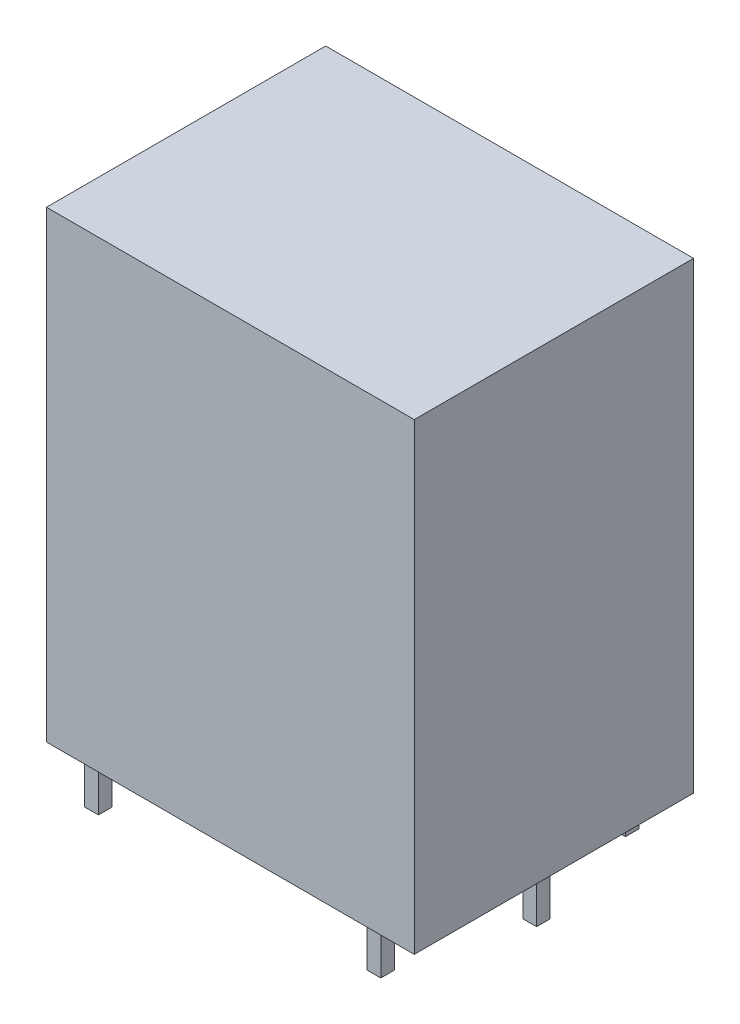
ISO-10303-21;
HEADER;
FILE_DESCRIPTION(('STEP AP214'),'2;1');
FILE_NAME('part.step','',(''),(''),'','','');
FILE_SCHEMA(('AUTOMOTIVE_DESIGN { 1 0 10303 214 1 1 1 1 }'));
ENDSEC;
DATA;
#1=APPLICATION_CONTEXT('core data for automotive mechanical design processes');
#2=APPLICATION_PROTOCOL_DEFINITION('international standard','automotive_design',2000,#1);
#3=PRODUCT_CONTEXT('',#1,'mechanical');
#4=PRODUCT('Part','Part','',(#3));
#5=PRODUCT_RELATED_PRODUCT_CATEGORY('part','',(#4));
#6=PRODUCT_DEFINITION_FORMATION('','',#4);
#7=PRODUCT_DEFINITION_CONTEXT('part definition',#1,'design');
#8=PRODUCT_DEFINITION('design','',#6,#7);
#9=PRODUCT_DEFINITION_SHAPE('','',#8);
#10=(LENGTH_UNIT() NAMED_UNIT(*) SI_UNIT(.MILLI.,.METRE.));
#11=(NAMED_UNIT(*) PLANE_ANGLE_UNIT() SI_UNIT($,.RADIAN.));
#12=(NAMED_UNIT(*) SI_UNIT($,.STERADIAN.) SOLID_ANGLE_UNIT());
#13=UNCERTAINTY_MEASURE_WITH_UNIT(LENGTH_MEASURE(1.E-05),#10,'distance_accuracy_value','');
#14=(GEOMETRIC_REPRESENTATION_CONTEXT(3) GLOBAL_UNCERTAINTY_ASSIGNED_CONTEXT((#13)) GLOBAL_UNIT_ASSIGNED_CONTEXT((#10,
#11,#12)) REPRESENTATION_CONTEXT('',''));
#15=CARTESIAN_POINT('',(0.,0.,0.));
#16=DIRECTION('',(0.,0.,1.));
#17=DIRECTION('',(1.,0.,0.));
#18=AXIS2_PLACEMENT_3D('',#15,#16,#17);
#19=CARTESIAN_POINT('',(-13.5,0.,10.25));
#20=DIRECTION('',(0.,1.,0.));
#21=DIRECTION('',(0.,0.,1.));
#22=AXIS2_PLACEMENT_3D('',#19,#20,#21);
#23=PLANE('',#22);
#24=DIRECTION('',(1.,0.,0.));
#25=VECTOR('',#24,1.);
#26=CARTESIAN_POINT('',(-10.46,0.,-9.48));
#27=LINE('',#26,#25);
#28=CARTESIAN_POINT('',(-11.46,0.,-9.48));
#29=VERTEX_POINT('',#28);
#30=CARTESIAN_POINT('',(-10.46,0.,-9.48));
#31=VERTEX_POINT('',#30);
#32=EDGE_CURVE('E214',#29,#31,#27,.T.);
#33=ORIENTED_EDGE('',*,*,#32,.F.);
#34=DIRECTION('',(0.,0.,-1.));
#35=VECTOR('',#34,1.);
#36=CARTESIAN_POINT('',(-11.46,0.,-9.48));
#37=LINE('',#36,#35);
#38=CARTESIAN_POINT('',(-11.46,0.,-8.48));
#39=VERTEX_POINT('',#38);
#40=EDGE_CURVE('E227',#39,#29,#37,.T.);
#41=ORIENTED_EDGE('',*,*,#40,.F.);
#42=DIRECTION('',(-1.,0.,0.));
#43=VECTOR('',#42,1.);
#44=CARTESIAN_POINT('',(-10.46,0.,-8.48));
#45=LINE('',#44,#43);
#46=CARTESIAN_POINT('',(-10.46,0.,-8.48));
#47=VERTEX_POINT('',#46);
#48=EDGE_CURVE('E236',#47,#39,#45,.T.);
#49=ORIENTED_EDGE('',*,*,#48,.F.);
#50=DIRECTION('',(0.,0.,1.));
#51=VECTOR('',#50,1.);
#52=CARTESIAN_POINT('',(-10.46,0.,-9.48));
#53=LINE('',#52,#51);
#54=EDGE_CURVE('E217',#31,#47,#53,.T.);
#55=ORIENTED_EDGE('',*,*,#54,.F.);
#56=EDGE_LOOP('',(#33,#41,#49,#55));
#57=FACE_BOUND('',#56,.T.);
#58=DIRECTION('',(0.,0.,1.));
#59=VECTOR('',#58,1.);
#60=CARTESIAN_POINT('',(10.27,0.,9.48));
#61=LINE('',#60,#59);
#62=CARTESIAN_POINT('',(10.27,0.,8.48));
#63=VERTEX_POINT('',#62);
#64=CARTESIAN_POINT('',(10.27,0.,9.48));
#65=VERTEX_POINT('',#64);
#66=EDGE_CURVE('E285',#63,#65,#61,.T.);
#67=ORIENTED_EDGE('',*,*,#66,.F.);
#68=DIRECTION('',(1.,0.,0.));
#69=VECTOR('',#68,1.);
#70=CARTESIAN_POINT('',(10.27,0.,8.48));
#71=LINE('',#70,#69);
#72=CARTESIAN_POINT('',(9.27000000000001,0.,8.48));
#73=VERTEX_POINT('',#72);
#74=EDGE_CURVE('E290',#73,#63,#71,.T.);
#75=ORIENTED_EDGE('',*,*,#74,.F.);
#76=DIRECTION('',(0.,0.,-1.));
#77=VECTOR('',#76,1.);
#78=CARTESIAN_POINT('',(9.27000000000001,0.,9.48));
#79=LINE('',#78,#77);
#80=CARTESIAN_POINT('',(9.27000000000001,0.,9.48));
#81=VERTEX_POINT('',#80);
#82=EDGE_CURVE('E302',#81,#73,#79,.T.);
#83=ORIENTED_EDGE('',*,*,#82,.F.);
#84=DIRECTION('',(-1.,0.,0.));
#85=VECTOR('',#84,1.);
#86=CARTESIAN_POINT('',(10.27,0.,9.48));
#87=LINE('',#86,#85);
#88=EDGE_CURVE('E299',#65,#81,#87,.T.);
#89=ORIENTED_EDGE('',*,*,#88,.F.);
#90=EDGE_LOOP('',(#67,#75,#83,#89));
#91=FACE_BOUND('',#90,.T.);
#92=DIRECTION('',(0.,0.,1.));
#93=VECTOR('',#92,1.);
#94=CARTESIAN_POINT('',(-13.5,0.,-10.25));
#95=LINE('',#94,#93);
#96=CARTESIAN_POINT('',(-13.5,0.,-10.25));
#97=VERTEX_POINT('',#96);
#98=CARTESIAN_POINT('',(-13.5,0.,10.25));
#99=VERTEX_POINT('',#98);
#100=EDGE_CURVE('E351',#97,#99,#95,.T.);
#101=ORIENTED_EDGE('',*,*,#100,.F.);
#102=DIRECTION('',(-1.,0.,0.));
#103=VECTOR('',#102,1.);
#104=CARTESIAN_POINT('',(-13.5,0.,-10.25));
#105=LINE('',#104,#103);
#106=CARTESIAN_POINT('',(13.5,0.,-10.25));
#107=VERTEX_POINT('',#106);
#108=EDGE_CURVE('E356',#107,#97,#105,.T.);
#109=ORIENTED_EDGE('',*,*,#108,.F.);
#110=DIRECTION('',(0.,0.,-1.));
#111=VECTOR('',#110,1.);
#112=CARTESIAN_POINT('',(13.5,0.,-10.25));
#113=LINE('',#112,#111);
#114=CARTESIAN_POINT('',(13.5,0.,10.25));
#115=VERTEX_POINT('',#114);
#116=EDGE_CURVE('E367',#115,#107,#113,.T.);
#117=ORIENTED_EDGE('',*,*,#116,.F.);
#118=DIRECTION('',(1.,0.,0.));
#119=VECTOR('',#118,1.);
#120=CARTESIAN_POINT('',(-13.5,0.,10.25));
#121=LINE('',#120,#119);
#122=EDGE_CURVE('E365',#99,#115,#121,.T.);
#123=ORIENTED_EDGE('',*,*,#122,.F.);
#124=EDGE_LOOP('',(#101,#109,#117,#123));
#125=FACE_BOUND('',#124,.T.);
#126=DIRECTION('',(0.,0.,1.));
#127=VECTOR('',#126,1.);
#128=CARTESIAN_POINT('',(12.73,0.,-0.499999999999999));
#129=LINE('',#128,#127);
#130=CARTESIAN_POINT('',(12.73,0.,-0.499999999999999));
#131=VERTEX_POINT('',#130);
#132=CARTESIAN_POINT('',(12.73,0.,0.500000000000007));
#133=VERTEX_POINT('',#132);
#134=EDGE_CURVE('E318',#131,#133,#129,.T.);
#135=ORIENTED_EDGE('',*,*,#134,.F.);
#136=DIRECTION('',(1.,0.,0.));
#137=VECTOR('',#136,1.);
#138=CARTESIAN_POINT('',(12.73,0.,-0.499999999999999));
#139=LINE('',#138,#137);
#140=CARTESIAN_POINT('',(11.73,0.,-0.499999999999999));
#141=VERTEX_POINT('',#140);
#142=EDGE_CURVE('E323',#141,#131,#139,.T.);
#143=ORIENTED_EDGE('',*,*,#142,.F.);
#144=DIRECTION('',(0.,0.,-1.));
#145=VECTOR('',#144,1.);
#146=CARTESIAN_POINT('',(11.73,0.,-0.499999999999999));
#147=LINE('',#146,#145);
#148=CARTESIAN_POINT('',(11.73,0.,0.500000000000009));
#149=VERTEX_POINT('',#148);
#150=EDGE_CURVE('E335',#149,#141,#147,.T.);
#151=ORIENTED_EDGE('',*,*,#150,.F.);
#152=DIRECTION('',(-1.,0.,0.));
#153=VECTOR('',#152,1.);
#154=CARTESIAN_POINT('',(12.73,0.,0.500000000000008));
#155=LINE('',#154,#153);
#156=EDGE_CURVE('E332',#133,#149,#155,.T.);
#157=ORIENTED_EDGE('',*,*,#156,.F.);
#158=EDGE_LOOP('',(#135,#143,#151,#157));
#159=FACE_BOUND('',#158,.T.);
#160=DIRECTION('',(0.,0.,1.));
#161=VECTOR('',#160,1.);
#162=CARTESIAN_POINT('',(-10.46,0.,9.48));
#163=LINE('',#162,#161);
#164=CARTESIAN_POINT('',(-10.46,0.,8.48));
#165=VERTEX_POINT('',#164);
#166=CARTESIAN_POINT('',(-10.46,0.,9.48));
#167=VERTEX_POINT('',#166);
#168=EDGE_CURVE('E252',#165,#167,#163,.T.);
#169=ORIENTED_EDGE('',*,*,#168,.F.);
#170=DIRECTION('',(1.,0.,0.));
#171=VECTOR('',#170,1.);
#172=CARTESIAN_POINT('',(-10.46,0.,8.48));
#173=LINE('',#172,#171);
#174=CARTESIAN_POINT('',(-11.46,0.,8.48));
#175=VERTEX_POINT('',#174);
#176=EDGE_CURVE('E257',#175,#165,#173,.T.);
#177=ORIENTED_EDGE('',*,*,#176,.F.);
#178=DIRECTION('',(0.,0.,-1.));
#179=VECTOR('',#178,1.);
#180=CARTESIAN_POINT('',(-11.46,0.,9.48));
#181=LINE('',#180,#179);
#182=CARTESIAN_POINT('',(-11.46,0.,9.48));
#183=VERTEX_POINT('',#182);
#184=EDGE_CURVE('E269',#183,#175,#181,.T.);
#185=ORIENTED_EDGE('',*,*,#184,.F.);
#186=DIRECTION('',(-1.,0.,0.));
#187=VECTOR('',#186,1.);
#188=CARTESIAN_POINT('',(-10.46,0.,9.48));
#189=LINE('',#188,#187);
#190=EDGE_CURVE('E266',#167,#183,#189,.T.);
#191=ORIENTED_EDGE('',*,*,#190,.F.);
#192=EDGE_LOOP('',(#169,#177,#185,#191));
#193=FACE_BOUND('',#192,.T.);
#194=DIRECTION('',(1.,0.,0.));
#195=VECTOR('',#194,1.);
#196=CARTESIAN_POINT('',(10.27,0.,-9.48));
#197=LINE('',#196,#195);
#198=CARTESIAN_POINT('',(9.27000000000001,0.,-9.48));
#199=VERTEX_POINT('',#198);
#200=CARTESIAN_POINT('',(10.27,0.,-9.48));
#201=VERTEX_POINT('',#200);
#202=EDGE_CURVE('E213',#199,#201,#197,.T.);
#203=ORIENTED_EDGE('',*,*,#202,.F.);
#204=DIRECTION('',(0.,0.,-1.));
#205=VECTOR('',#204,1.);
#206=CARTESIAN_POINT('',(9.27000000000001,0.,-9.48));
#207=LINE('',#206,#205);
#208=CARTESIAN_POINT('',(9.27000000000001,0.,-8.48));
#209=VERTEX_POINT('',#208);
#210=EDGE_CURVE('E210',#209,#199,#207,.T.);
#211=ORIENTED_EDGE('',*,*,#210,.F.);
#212=DIRECTION('',(-1.,0.,0.));
#213=VECTOR('',#212,1.);
#214=CARTESIAN_POINT('',(10.27,0.,-8.48));
#215=LINE('',#214,#213);
#216=CARTESIAN_POINT('',(10.27,0.,-8.48));
#217=VERTEX_POINT('',#216);
#218=EDGE_CURVE('E52',#217,#209,#215,.T.);
#219=ORIENTED_EDGE('',*,*,#218,.F.);
#220=DIRECTION('',(0.,0.,1.));
#221=VECTOR('',#220,1.);
#222=CARTESIAN_POINT('',(10.27,0.,-9.48));
#223=LINE('',#222,#221);
#224=EDGE_CURVE('E47',#201,#217,#223,.T.);
#225=ORIENTED_EDGE('',*,*,#224,.F.);
#226=EDGE_LOOP('',(#203,#211,#219,#225));
#227=FACE_BOUND('',#226,.T.);
#228=ADVANCED_FACE('F32',(#57,#91,#125,#159,#193,#227),#23,.F.);
#229=CARTESIAN_POINT('',(-13.5,34.,-10.25));
#230=DIRECTION('',(1.,0.,0.));
#231=DIRECTION('',(0.,0.,-1.));
#232=AXIS2_PLACEMENT_3D('',#229,#230,#231);
#233=PLANE('',#232);
#234=ORIENTED_EDGE('',*,*,#100,.T.);
#235=DIRECTION('',(0.,-1.,0.));
#236=VECTOR('',#235,1.);
#237=CARTESIAN_POINT('',(-13.5,34.,10.25));
#238=LINE('',#237,#236);
#239=CARTESIAN_POINT('',(-13.5,34.,10.25));
#240=VERTEX_POINT('',#239);
#241=EDGE_CURVE('E11',#240,#99,#238,.T.);
#242=ORIENTED_EDGE('',*,*,#241,.F.);
#243=DIRECTION('',(0.,0.,1.));
#244=VECTOR('',#243,1.);
#245=CARTESIAN_POINT('',(-13.5,34.,-10.25));
#246=LINE('',#245,#244);
#247=CARTESIAN_POINT('',(-13.5,34.,-10.25));
#248=VERTEX_POINT('',#247);
#249=EDGE_CURVE('E352',#248,#240,#246,.T.);
#250=ORIENTED_EDGE('',*,*,#249,.F.);
#251=DIRECTION('',(0.,-1.,0.));
#252=VECTOR('',#251,1.);
#253=CARTESIAN_POINT('',(-13.5,34.,-10.25));
#254=LINE('',#253,#252);
#255=EDGE_CURVE('E362',#248,#97,#254,.T.);
#256=ORIENTED_EDGE('',*,*,#255,.T.);
#257=EDGE_LOOP('',(#234,#242,#250,#256));
#258=FACE_BOUND('',#257,.T.);
#259=ADVANCED_FACE('F34',(#258),#233,.F.);
#260=CARTESIAN_POINT('',(-13.5,34.,10.25));
#261=DIRECTION('',(0.,0.,-1.));
#262=DIRECTION('',(-1.,0.,0.));
#263=AXIS2_PLACEMENT_3D('',#260,#261,#262);
#264=PLANE('',#263);
#265=ORIENTED_EDGE('',*,*,#122,.T.);
#266=DIRECTION('',(0.,-1.,0.));
#267=VECTOR('',#266,1.);
#268=CARTESIAN_POINT('',(13.5,34.,10.25));
#269=LINE('',#268,#267);
#270=CARTESIAN_POINT('',(13.5,34.,10.25));
#271=VERTEX_POINT('',#270);
#272=EDGE_CURVE('E40',#271,#115,#269,.T.);
#273=ORIENTED_EDGE('',*,*,#272,.F.);
#274=DIRECTION('',(1.,0.,0.));
#275=VECTOR('',#274,1.);
#276=CARTESIAN_POINT('',(-13.5,34.,10.25));
#277=LINE('',#276,#275);
#278=EDGE_CURVE('E355',#240,#271,#277,.T.);
#279=ORIENTED_EDGE('',*,*,#278,.F.);
#280=ORIENTED_EDGE('',*,*,#241,.T.);
#281=EDGE_LOOP('',(#265,#273,#279,#280));
#282=FACE_BOUND('',#281,.T.);
#283=ADVANCED_FACE('F395',(#282),#264,.F.);
#284=CARTESIAN_POINT('',(13.5,34.,-10.25));
#285=DIRECTION('',(-1.,0.,0.));
#286=DIRECTION('',(0.,0.,1.));
#287=AXIS2_PLACEMENT_3D('',#284,#285,#286);
#288=PLANE('',#287);
#289=ORIENTED_EDGE('',*,*,#116,.T.);
#290=DIRECTION('',(0.,-1.,0.));
#291=VECTOR('',#290,1.);
#292=CARTESIAN_POINT('',(13.5,34.,-10.25));
#293=LINE('',#292,#291);
#294=CARTESIAN_POINT('',(13.5,34.,-10.25));
#295=VERTEX_POINT('',#294);
#296=EDGE_CURVE('E372',#295,#107,#293,.T.);
#297=ORIENTED_EDGE('',*,*,#296,.F.);
#298=DIRECTION('',(0.,0.,-1.));
#299=VECTOR('',#298,1.);
#300=CARTESIAN_POINT('',(13.5,34.,-10.25));
#301=LINE('',#300,#299);
#302=EDGE_CURVE('E358',#271,#295,#301,.T.);
#303=ORIENTED_EDGE('',*,*,#302,.F.);
#304=ORIENTED_EDGE('',*,*,#272,.T.);
#305=EDGE_LOOP('',(#289,#297,#303,#304));
#306=FACE_BOUND('',#305,.T.);
#307=ADVANCED_FACE('F379',(#306),#288,.F.);
#308=CARTESIAN_POINT('',(-13.5,34.,-10.25));
#309=DIRECTION('',(0.,0.,1.));
#310=DIRECTION('',(1.,0.,0.));
#311=AXIS2_PLACEMENT_3D('',#308,#309,#310);
#312=PLANE('',#311);
#313=ORIENTED_EDGE('',*,*,#108,.T.);
#314=ORIENTED_EDGE('',*,*,#255,.F.);
#315=DIRECTION('',(-1.,0.,0.));
#316=VECTOR('',#315,1.);
#317=CARTESIAN_POINT('',(-13.5,34.,-10.25));
#318=LINE('',#317,#316);
#319=EDGE_CURVE('E360',#295,#248,#318,.T.);
#320=ORIENTED_EDGE('',*,*,#319,.F.);
#321=ORIENTED_EDGE('',*,*,#296,.T.);
#322=EDGE_LOOP('',(#313,#314,#320,#321));
#323=FACE_BOUND('',#322,.T.);
#324=ADVANCED_FACE('F388',(#323),#312,.F.);
#325=CARTESIAN_POINT('',(-13.5,34.,10.25));
#326=DIRECTION('',(0.,1.,0.));
#327=DIRECTION('',(0.,0.,1.));
#328=AXIS2_PLACEMENT_3D('',#325,#326,#327);
#329=PLANE('',#328);
#330=ORIENTED_EDGE('',*,*,#249,.T.);
#331=ORIENTED_EDGE('',*,*,#278,.T.);
#332=ORIENTED_EDGE('',*,*,#302,.T.);
#333=ORIENTED_EDGE('',*,*,#319,.T.);
#334=EDGE_LOOP('',(#330,#331,#332,#333));
#335=FACE_BOUND('',#334,.T.);
#336=ADVANCED_FACE('F394',(#335),#329,.T.);
#337=CARTESIAN_POINT('',(12.73,-3.5,-0.499999999999999));
#338=DIRECTION('',(-1.,0.,0.));
#339=DIRECTION('',(0.,0.,1.));
#340=AXIS2_PLACEMENT_3D('',#337,#338,#339);
#341=PLANE('',#340);
#342=ORIENTED_EDGE('',*,*,#134,.T.);
#343=DIRECTION('',(0.,1.,0.));
#344=VECTOR('',#343,1.);
#345=CARTESIAN_POINT('',(12.73,-3.5,0.500000000000008));
#346=LINE('',#345,#344);
#347=CARTESIAN_POINT('',(12.73,-3.5,0.500000000000008));
#348=VERTEX_POINT('',#347);
#349=EDGE_CURVE('E348',#348,#133,#346,.T.);
#350=ORIENTED_EDGE('',*,*,#349,.F.);
#351=DIRECTION('',(0.,0.,1.));
#352=VECTOR('',#351,1.);
#353=CARTESIAN_POINT('',(12.73,-3.5,-0.499999999999999));
#354=LINE('',#353,#352);
#355=CARTESIAN_POINT('',(12.73,-3.5,-0.499999999999999));
#356=VERTEX_POINT('',#355);
#357=EDGE_CURVE('E319',#356,#348,#354,.T.);
#358=ORIENTED_EDGE('',*,*,#357,.F.);
#359=DIRECTION('',(0.,1.,0.));
#360=VECTOR('',#359,1.);
#361=CARTESIAN_POINT('',(12.73,-3.5,-0.499999999999999));
#362=LINE('',#361,#360);
#363=EDGE_CURVE('E329',#356,#131,#362,.T.);
#364=ORIENTED_EDGE('',*,*,#363,.T.);
#365=EDGE_LOOP('',(#342,#350,#358,#364));
#366=FACE_BOUND('',#365,.T.);
#367=ADVANCED_FACE('F415',(#366),#341,.F.);
#368=CARTESIAN_POINT('',(12.73,-3.5,0.500000000000008));
#369=DIRECTION('',(0.,0.,-1.));
#370=DIRECTION('',(-1.,0.,0.));
#371=AXIS2_PLACEMENT_3D('',#368,#369,#370);
#372=PLANE('',#371);
#373=ORIENTED_EDGE('',*,*,#156,.T.);
#374=DIRECTION('',(0.,1.,0.));
#375=VECTOR('',#374,1.);
#376=CARTESIAN_POINT('',(11.73,-3.5,0.500000000000008));
#377=LINE('',#376,#375);
#378=CARTESIAN_POINT('',(11.73,-3.5,0.500000000000008));
#379=VERTEX_POINT('',#378);
#380=EDGE_CURVE('E345',#379,#149,#377,.T.);
#381=ORIENTED_EDGE('',*,*,#380,.F.);
#382=DIRECTION('',(-1.,0.,0.));
#383=VECTOR('',#382,1.);
#384=CARTESIAN_POINT('',(12.73,-3.5,0.500000000000008));
#385=LINE('',#384,#383);
#386=EDGE_CURVE('E322',#348,#379,#385,.T.);
#387=ORIENTED_EDGE('',*,*,#386,.F.);
#388=ORIENTED_EDGE('',*,*,#349,.T.);
#389=EDGE_LOOP('',(#373,#381,#387,#388));
#390=FACE_BOUND('',#389,.T.);
#391=ADVANCED_FACE('F419',(#390),#372,.F.);
#392=CARTESIAN_POINT('',(11.73,-3.5,-0.499999999999999));
#393=DIRECTION('',(1.,0.,0.));
#394=DIRECTION('',(0.,0.,-1.));
#395=AXIS2_PLACEMENT_3D('',#392,#393,#394);
#396=PLANE('',#395);
#397=ORIENTED_EDGE('',*,*,#150,.T.);
#398=DIRECTION('',(0.,1.,0.));
#399=VECTOR('',#398,1.);
#400=CARTESIAN_POINT('',(11.73,-3.5,-0.499999999999999));
#401=LINE('',#400,#399);
#402=CARTESIAN_POINT('',(11.73,-3.5,-0.499999999999999));
#403=VERTEX_POINT('',#402);
#404=EDGE_CURVE('E342',#403,#141,#401,.T.);
#405=ORIENTED_EDGE('',*,*,#404,.F.);
#406=DIRECTION('',(0.,0.,-1.));
#407=VECTOR('',#406,1.);
#408=CARTESIAN_POINT('',(11.73,-3.5,-0.499999999999999));
#409=LINE('',#408,#407);
#410=EDGE_CURVE('E325',#379,#403,#409,.T.);
#411=ORIENTED_EDGE('',*,*,#410,.F.);
#412=ORIENTED_EDGE('',*,*,#380,.T.);
#413=EDGE_LOOP('',(#397,#405,#411,#412));
#414=FACE_BOUND('',#413,.T.);
#415=ADVANCED_FACE('F424',(#414),#396,.F.);
#416=CARTESIAN_POINT('',(12.73,-3.5,-0.499999999999999));
#417=DIRECTION('',(0.,0.,1.));
#418=DIRECTION('',(1.,0.,0.));
#419=AXIS2_PLACEMENT_3D('',#416,#417,#418);
#420=PLANE('',#419);
#421=ORIENTED_EDGE('',*,*,#142,.T.);
#422=ORIENTED_EDGE('',*,*,#363,.F.);
#423=DIRECTION('',(1.,0.,0.));
#424=VECTOR('',#423,1.);
#425=CARTESIAN_POINT('',(12.73,-3.5,-0.499999999999999));
#426=LINE('',#425,#424);
#427=EDGE_CURVE('E327',#403,#356,#426,.T.);
#428=ORIENTED_EDGE('',*,*,#427,.F.);
#429=ORIENTED_EDGE('',*,*,#404,.T.);
#430=EDGE_LOOP('',(#421,#422,#428,#429));
#431=FACE_BOUND('',#430,.T.);
#432=ADVANCED_FACE('F430',(#431),#420,.F.);
#433=CARTESIAN_POINT('',(12.73,-3.5,0.500000000000008));
#434=DIRECTION('',(0.,-1.,0.));
#435=DIRECTION('',(0.,0.,-1.));
#436=AXIS2_PLACEMENT_3D('',#433,#434,#435);
#437=PLANE('',#436);
#438=ORIENTED_EDGE('',*,*,#357,.T.);
#439=ORIENTED_EDGE('',*,*,#386,.T.);
#440=ORIENTED_EDGE('',*,*,#410,.T.);
#441=ORIENTED_EDGE('',*,*,#427,.T.);
#442=EDGE_LOOP('',(#438,#439,#440,#441));
#443=FACE_BOUND('',#442,.T.);
#444=ADVANCED_FACE('F434',(#443),#437,.T.);
#445=CARTESIAN_POINT('',(10.27,-3.5,9.48));
#446=DIRECTION('',(-1.,0.,0.));
#447=DIRECTION('',(0.,0.,1.));
#448=AXIS2_PLACEMENT_3D('',#445,#446,#447);
#449=PLANE('',#448);
#450=ORIENTED_EDGE('',*,*,#66,.T.);
#451=DIRECTION('',(0.,1.,0.));
#452=VECTOR('',#451,1.);
#453=CARTESIAN_POINT('',(10.27,-3.5,9.48));
#454=LINE('',#453,#452);
#455=CARTESIAN_POINT('',(10.27,-3.5,9.48));
#456=VERTEX_POINT('',#455);
#457=EDGE_CURVE('E315',#456,#65,#454,.T.);
#458=ORIENTED_EDGE('',*,*,#457,.F.);
#459=DIRECTION('',(0.,0.,1.));
#460=VECTOR('',#459,1.);
#461=CARTESIAN_POINT('',(10.27,-3.5,9.48));
#462=LINE('',#461,#460);
#463=CARTESIAN_POINT('',(10.27,-3.5,8.48));
#464=VERTEX_POINT('',#463);
#465=EDGE_CURVE('E286',#464,#456,#462,.T.);
#466=ORIENTED_EDGE('',*,*,#465,.F.);
#467=DIRECTION('',(0.,1.,0.));
#468=VECTOR('',#467,1.);
#469=CARTESIAN_POINT('',(10.27,-3.5,8.48));
#470=LINE('',#469,#468);
#471=EDGE_CURVE('E296',#464,#63,#470,.T.);
#472=ORIENTED_EDGE('',*,*,#471,.T.);
#473=EDGE_LOOP('',(#450,#458,#466,#472));
#474=FACE_BOUND('',#473,.T.);
#475=ADVANCED_FACE('F438',(#474),#449,.F.);
#476=CARTESIAN_POINT('',(10.27,-3.5,9.48));
#477=DIRECTION('',(0.,0.,-1.));
#478=DIRECTION('',(-1.,0.,0.));
#479=AXIS2_PLACEMENT_3D('',#476,#477,#478);
#480=PLANE('',#479);
#481=ORIENTED_EDGE('',*,*,#88,.T.);
#482=DIRECTION('',(0.,1.,0.));
#483=VECTOR('',#482,1.);
#484=CARTESIAN_POINT('',(9.27000000000001,-3.5,9.48));
#485=LINE('',#484,#483);
#486=CARTESIAN_POINT('',(9.27000000000001,-3.5,9.48));
#487=VERTEX_POINT('',#486);
#488=EDGE_CURVE('E312',#487,#81,#485,.T.);
#489=ORIENTED_EDGE('',*,*,#488,.F.);
#490=DIRECTION('',(-1.,0.,0.));
#491=VECTOR('',#490,1.);
#492=CARTESIAN_POINT('',(10.27,-3.5,9.48));
#493=LINE('',#492,#491);
#494=EDGE_CURVE('E289',#456,#487,#493,.T.);
#495=ORIENTED_EDGE('',*,*,#494,.F.);
#496=ORIENTED_EDGE('',*,*,#457,.T.);
#497=EDGE_LOOP('',(#481,#489,#495,#496));
#498=FACE_BOUND('',#497,.T.);
#499=ADVANCED_FACE('F442',(#498),#480,.F.);
#500=CARTESIAN_POINT('',(9.27000000000001,-3.5,9.48));
#501=DIRECTION('',(1.,0.,0.));
#502=DIRECTION('',(0.,0.,-1.));
#503=AXIS2_PLACEMENT_3D('',#500,#501,#502);
#504=PLANE('',#503);
#505=ORIENTED_EDGE('',*,*,#82,.T.);
#506=DIRECTION('',(0.,1.,0.));
#507=VECTOR('',#506,1.);
#508=CARTESIAN_POINT('',(9.27000000000001,-3.5,8.48));
#509=LINE('',#508,#507);
#510=CARTESIAN_POINT('',(9.27000000000001,-3.5,8.48));
#511=VERTEX_POINT('',#510);
#512=EDGE_CURVE('E309',#511,#73,#509,.T.);
#513=ORIENTED_EDGE('',*,*,#512,.F.);
#514=DIRECTION('',(0.,0.,-1.));
#515=VECTOR('',#514,1.);
#516=CARTESIAN_POINT('',(9.27000000000001,-3.5,9.48));
#517=LINE('',#516,#515);
#518=EDGE_CURVE('E292',#487,#511,#517,.T.);
#519=ORIENTED_EDGE('',*,*,#518,.F.);
#520=ORIENTED_EDGE('',*,*,#488,.T.);
#521=EDGE_LOOP('',(#505,#513,#519,#520));
#522=FACE_BOUND('',#521,.T.);
#523=ADVANCED_FACE('F446',(#522),#504,.F.);
#524=CARTESIAN_POINT('',(10.27,-3.5,8.48));
#525=DIRECTION('',(0.,0.,1.));
#526=DIRECTION('',(1.,0.,0.));
#527=AXIS2_PLACEMENT_3D('',#524,#525,#526);
#528=PLANE('',#527);
#529=ORIENTED_EDGE('',*,*,#74,.T.);
#530=ORIENTED_EDGE('',*,*,#471,.F.);
#531=DIRECTION('',(1.,0.,0.));
#532=VECTOR('',#531,1.);
#533=CARTESIAN_POINT('',(10.27,-3.5,8.48));
#534=LINE('',#533,#532);
#535=EDGE_CURVE('E294',#511,#464,#534,.T.);
#536=ORIENTED_EDGE('',*,*,#535,.F.);
#537=ORIENTED_EDGE('',*,*,#512,.T.);
#538=EDGE_LOOP('',(#529,#530,#536,#537));
#539=FACE_BOUND('',#538,.T.);
#540=ADVANCED_FACE('F450',(#539),#528,.F.);
#541=CARTESIAN_POINT('',(10.27,-3.5,9.48));
#542=DIRECTION('',(0.,1.,0.));
#543=DIRECTION('',(0.,0.,1.));
#544=AXIS2_PLACEMENT_3D('',#541,#542,#543);
#545=PLANE('',#544);
#546=ORIENTED_EDGE('',*,*,#465,.T.);
#547=ORIENTED_EDGE('',*,*,#494,.T.);
#548=ORIENTED_EDGE('',*,*,#518,.T.);
#549=ORIENTED_EDGE('',*,*,#535,.T.);
#550=EDGE_LOOP('',(#546,#547,#548,#549));
#551=FACE_BOUND('',#550,.T.);
#552=ADVANCED_FACE('F454',(#551),#545,.F.);
#553=CARTESIAN_POINT('',(-10.46,-3.5,9.48));
#554=DIRECTION('',(-1.,0.,0.));
#555=DIRECTION('',(0.,0.,1.));
#556=AXIS2_PLACEMENT_3D('',#553,#554,#555);
#557=PLANE('',#556);
#558=ORIENTED_EDGE('',*,*,#168,.T.);
#559=DIRECTION('',(0.,1.,0.));
#560=VECTOR('',#559,1.);
#561=CARTESIAN_POINT('',(-10.46,-3.5,9.48));
#562=LINE('',#561,#560);
#563=CARTESIAN_POINT('',(-10.46,-3.5,9.48));
#564=VERTEX_POINT('',#563);
#565=EDGE_CURVE('E282',#564,#167,#562,.T.);
#566=ORIENTED_EDGE('',*,*,#565,.F.);
#567=DIRECTION('',(0.,0.,1.));
#568=VECTOR('',#567,1.);
#569=CARTESIAN_POINT('',(-10.46,-3.5,9.48));
#570=LINE('',#569,#568);
#571=CARTESIAN_POINT('',(-10.46,-3.5,8.48));
#572=VERTEX_POINT('',#571);
#573=EDGE_CURVE('E253',#572,#564,#570,.T.);
#574=ORIENTED_EDGE('',*,*,#573,.F.);
#575=DIRECTION('',(0.,1.,0.));
#576=VECTOR('',#575,1.);
#577=CARTESIAN_POINT('',(-10.46,-3.5,8.48));
#578=LINE('',#577,#576);
#579=EDGE_CURVE('E263',#572,#165,#578,.T.);
#580=ORIENTED_EDGE('',*,*,#579,.T.);
#581=EDGE_LOOP('',(#558,#566,#574,#580));
#582=FACE_BOUND('',#581,.T.);
#583=ADVANCED_FACE('F458',(#582),#557,.F.);
#584=CARTESIAN_POINT('',(-10.46,-3.5,9.48));
#585=DIRECTION('',(0.,0.,-1.));
#586=DIRECTION('',(-1.,0.,0.));
#587=AXIS2_PLACEMENT_3D('',#584,#585,#586);
#588=PLANE('',#587);
#589=ORIENTED_EDGE('',*,*,#190,.T.);
#590=DIRECTION('',(0.,1.,0.));
#591=VECTOR('',#590,1.);
#592=CARTESIAN_POINT('',(-11.46,-3.5,9.48));
#593=LINE('',#592,#591);
#594=CARTESIAN_POINT('',(-11.46,-3.5,9.48));
#595=VERTEX_POINT('',#594);
#596=EDGE_CURVE('E279',#595,#183,#593,.T.);
#597=ORIENTED_EDGE('',*,*,#596,.F.);
#598=DIRECTION('',(-1.,0.,0.));
#599=VECTOR('',#598,1.);
#600=CARTESIAN_POINT('',(-10.46,-3.5,9.48));
#601=LINE('',#600,#599);
#602=EDGE_CURVE('E256',#564,#595,#601,.T.);
#603=ORIENTED_EDGE('',*,*,#602,.F.);
#604=ORIENTED_EDGE('',*,*,#565,.T.);
#605=EDGE_LOOP('',(#589,#597,#603,#604));
#606=FACE_BOUND('',#605,.T.);
#607=ADVANCED_FACE('F462',(#606),#588,.F.);
#608=CARTESIAN_POINT('',(-11.46,-3.5,9.48));
#609=DIRECTION('',(1.,0.,0.));
#610=DIRECTION('',(0.,0.,-1.));
#611=AXIS2_PLACEMENT_3D('',#608,#609,#610);
#612=PLANE('',#611);
#613=ORIENTED_EDGE('',*,*,#184,.T.);
#614=DIRECTION('',(0.,1.,0.));
#615=VECTOR('',#614,1.);
#616=CARTESIAN_POINT('',(-11.46,-3.5,8.48));
#617=LINE('',#616,#615);
#618=CARTESIAN_POINT('',(-11.46,-3.5,8.48));
#619=VERTEX_POINT('',#618);
#620=EDGE_CURVE('E276',#619,#175,#617,.T.);
#621=ORIENTED_EDGE('',*,*,#620,.F.);
#622=DIRECTION('',(0.,0.,-1.));
#623=VECTOR('',#622,1.);
#624=CARTESIAN_POINT('',(-11.46,-3.5,9.48));
#625=LINE('',#624,#623);
#626=EDGE_CURVE('E259',#595,#619,#625,.T.);
#627=ORIENTED_EDGE('',*,*,#626,.F.);
#628=ORIENTED_EDGE('',*,*,#596,.T.);
#629=EDGE_LOOP('',(#613,#621,#627,#628));
#630=FACE_BOUND('',#629,.T.);
#631=ADVANCED_FACE('F466',(#630),#612,.F.);
#632=CARTESIAN_POINT('',(-10.46,-3.5,8.48));
#633=DIRECTION('',(0.,0.,1.));
#634=DIRECTION('',(1.,0.,0.));
#635=AXIS2_PLACEMENT_3D('',#632,#633,#634);
#636=PLANE('',#635);
#637=ORIENTED_EDGE('',*,*,#176,.T.);
#638=ORIENTED_EDGE('',*,*,#579,.F.);
#639=DIRECTION('',(1.,0.,0.));
#640=VECTOR('',#639,1.);
#641=CARTESIAN_POINT('',(-10.46,-3.5,8.48));
#642=LINE('',#641,#640);
#643=EDGE_CURVE('E261',#619,#572,#642,.T.);
#644=ORIENTED_EDGE('',*,*,#643,.F.);
#645=ORIENTED_EDGE('',*,*,#620,.T.);
#646=EDGE_LOOP('',(#637,#638,#644,#645));
#647=FACE_BOUND('',#646,.T.);
#648=ADVANCED_FACE('F470',(#647),#636,.F.);
#649=CARTESIAN_POINT('',(-10.46,-3.5,8.48));
#650=DIRECTION('',(0.,1.,0.));
#651=DIRECTION('',(0.,0.,1.));
#652=AXIS2_PLACEMENT_3D('',#649,#650,#651);
#653=PLANE('',#652);
#654=ORIENTED_EDGE('',*,*,#573,.T.);
#655=ORIENTED_EDGE('',*,*,#602,.T.);
#656=ORIENTED_EDGE('',*,*,#626,.T.);
#657=ORIENTED_EDGE('',*,*,#643,.T.);
#658=EDGE_LOOP('',(#654,#655,#656,#657));
#659=FACE_BOUND('',#658,.T.);
#660=ADVANCED_FACE('F474',(#659),#653,.F.);
#661=CARTESIAN_POINT('',(-10.46,-3.5,-9.48));
#662=DIRECTION('',(0.,0.,1.));
#663=DIRECTION('',(1.,0.,0.));
#664=AXIS2_PLACEMENT_3D('',#661,#662,#663);
#665=PLANE('',#664);
#666=ORIENTED_EDGE('',*,*,#32,.T.);
#667=DIRECTION('',(0.,1.,0.));
#668=VECTOR('',#667,1.);
#669=CARTESIAN_POINT('',(-10.46,-3.5,-9.48));
#670=LINE('',#669,#668);
#671=CARTESIAN_POINT('',(-10.46,-3.5,-9.48));
#672=VERTEX_POINT('',#671);
#673=EDGE_CURVE('E249',#672,#31,#670,.T.);
#674=ORIENTED_EDGE('',*,*,#673,.F.);
#675=DIRECTION('',(1.,0.,0.));
#676=VECTOR('',#675,1.);
#677=CARTESIAN_POINT('',(-10.46,-3.5,-9.48));
#678=LINE('',#677,#676);
#679=CARTESIAN_POINT('',(-11.46,-3.5,-9.48));
#680=VERTEX_POINT('',#679);
#681=EDGE_CURVE('E223',#680,#672,#678,.T.);
#682=ORIENTED_EDGE('',*,*,#681,.F.);
#683=DIRECTION('',(0.,1.,0.));
#684=VECTOR('',#683,1.);
#685=CARTESIAN_POINT('',(-11.46,-3.5,-9.48));
#686=LINE('',#685,#684);
#687=EDGE_CURVE('E232',#680,#29,#686,.T.);
#688=ORIENTED_EDGE('',*,*,#687,.T.);
#689=EDGE_LOOP('',(#666,#674,#682,#688));
#690=FACE_BOUND('',#689,.T.);
#691=ADVANCED_FACE('F478',(#690),#665,.F.);
#692=CARTESIAN_POINT('',(-10.46,-3.5,-9.48));
#693=DIRECTION('',(-1.,0.,0.));
#694=DIRECTION('',(0.,0.,1.));
#695=AXIS2_PLACEMENT_3D('',#692,#693,#694);
#696=PLANE('',#695);
#697=ORIENTED_EDGE('',*,*,#54,.T.);
#698=DIRECTION('',(0.,1.,0.));
#699=VECTOR('',#698,1.);
#700=CARTESIAN_POINT('',(-10.46,-3.5,-8.48));
#701=LINE('',#700,#699);
#702=CARTESIAN_POINT('',(-10.46,-3.5,-8.48));
#703=VERTEX_POINT('',#702);
#704=EDGE_CURVE('E246',#703,#47,#701,.T.);
#705=ORIENTED_EDGE('',*,*,#704,.F.);
#706=DIRECTION('',(0.,0.,1.));
#707=VECTOR('',#706,1.);
#708=CARTESIAN_POINT('',(-10.46,-3.5,-9.48));
#709=LINE('',#708,#707);
#710=EDGE_CURVE('E226',#672,#703,#709,.T.);
#711=ORIENTED_EDGE('',*,*,#710,.F.);
#712=ORIENTED_EDGE('',*,*,#673,.T.);
#713=EDGE_LOOP('',(#697,#705,#711,#712));
#714=FACE_BOUND('',#713,.T.);
#715=ADVANCED_FACE('F482',(#714),#696,.F.);
#716=CARTESIAN_POINT('',(-10.46,-3.5,-8.48));
#717=DIRECTION('',(0.,0.,-1.));
#718=DIRECTION('',(-1.,0.,0.));
#719=AXIS2_PLACEMENT_3D('',#716,#717,#718);
#720=PLANE('',#719);
#721=ORIENTED_EDGE('',*,*,#48,.T.);
#722=DIRECTION('',(0.,1.,0.));
#723=VECTOR('',#722,1.);
#724=CARTESIAN_POINT('',(-11.46,-3.5,-8.48));
#725=LINE('',#724,#723);
#726=CARTESIAN_POINT('',(-11.46,-3.5,-8.48));
#727=VERTEX_POINT('',#726);
#728=EDGE_CURVE('E243',#727,#39,#725,.T.);
#729=ORIENTED_EDGE('',*,*,#728,.F.);
#730=DIRECTION('',(-1.,0.,0.));
#731=VECTOR('',#730,1.);
#732=CARTESIAN_POINT('',(-10.46,-3.5,-8.48));
#733=LINE('',#732,#731);
#734=EDGE_CURVE('E229',#703,#727,#733,.T.);
#735=ORIENTED_EDGE('',*,*,#734,.F.);
#736=ORIENTED_EDGE('',*,*,#704,.T.);
#737=EDGE_LOOP('',(#721,#729,#735,#736));
#738=FACE_BOUND('',#737,.T.);
#739=ADVANCED_FACE('F486',(#738),#720,.F.);
#740=CARTESIAN_POINT('',(-11.46,-3.5,-9.48));
#741=DIRECTION('',(1.,0.,0.));
#742=DIRECTION('',(0.,0.,-1.));
#743=AXIS2_PLACEMENT_3D('',#740,#741,#742);
#744=PLANE('',#743);
#745=ORIENTED_EDGE('',*,*,#40,.T.);
#746=ORIENTED_EDGE('',*,*,#687,.F.);
#747=DIRECTION('',(0.,0.,-1.));
#748=VECTOR('',#747,1.);
#749=CARTESIAN_POINT('',(-11.46,-3.5,-9.48));
#750=LINE('',#749,#748);
#751=EDGE_CURVE('E231',#727,#680,#750,.T.);
#752=ORIENTED_EDGE('',*,*,#751,.F.);
#753=ORIENTED_EDGE('',*,*,#728,.T.);
#754=EDGE_LOOP('',(#745,#746,#752,#753));
#755=FACE_BOUND('',#754,.T.);
#756=ADVANCED_FACE('F490',(#755),#744,.F.);
#757=CARTESIAN_POINT('',(-11.46,-3.5,-9.48));
#758=DIRECTION('',(0.,1.,0.));
#759=DIRECTION('',(0.,0.,1.));
#760=AXIS2_PLACEMENT_3D('',#757,#758,#759);
#761=PLANE('',#760);
#762=ORIENTED_EDGE('',*,*,#681,.T.);
#763=ORIENTED_EDGE('',*,*,#710,.T.);
#764=ORIENTED_EDGE('',*,*,#734,.T.);
#765=ORIENTED_EDGE('',*,*,#751,.T.);
#766=EDGE_LOOP('',(#762,#763,#764,#765));
#767=FACE_BOUND('',#766,.T.);
#768=ADVANCED_FACE('F494',(#767),#761,.F.);
#769=CARTESIAN_POINT('',(10.27,-3.5,-9.48));
#770=DIRECTION('',(0.,0.,1.));
#771=DIRECTION('',(1.,0.,0.));
#772=AXIS2_PLACEMENT_3D('',#769,#770,#771);
#773=PLANE('',#772);
#774=ORIENTED_EDGE('',*,*,#202,.T.);
#775=DIRECTION('',(0.,1.,0.));
#776=VECTOR('',#775,1.);
#777=CARTESIAN_POINT('',(10.27,-3.5,-9.48));
#778=LINE('',#777,#776);
#779=CARTESIAN_POINT('',(10.27,-3.5,-9.48));
#780=VERTEX_POINT('',#779);
#781=EDGE_CURVE('E194',#780,#201,#778,.T.);
#782=ORIENTED_EDGE('',*,*,#781,.F.);
#783=DIRECTION('',(1.,0.,0.));
#784=VECTOR('',#783,1.);
#785=CARTESIAN_POINT('',(10.27,-3.5,-9.48));
#786=LINE('',#785,#784);
#787=CARTESIAN_POINT('',(9.27000000000001,-3.5,-9.48));
#788=VERTEX_POINT('',#787);
#789=EDGE_CURVE('E201',#788,#780,#786,.T.);
#790=ORIENTED_EDGE('',*,*,#789,.F.);
#791=DIRECTION('',(0.,1.,0.));
#792=VECTOR('',#791,1.);
#793=CARTESIAN_POINT('',(9.27000000000001,-3.5,-9.48));
#794=LINE('',#793,#792);
#795=EDGE_CURVE('E690',#788,#199,#794,.T.);
#796=ORIENTED_EDGE('',*,*,#795,.T.);
#797=EDGE_LOOP('',(#774,#782,#790,#796));
#798=FACE_BOUND('',#797,.T.);
#799=ADVANCED_FACE('F212',(#798),#773,.F.);
#800=CARTESIAN_POINT('',(10.27,-3.5,-9.48));
#801=DIRECTION('',(-1.,0.,0.));
#802=DIRECTION('',(0.,0.,1.));
#803=AXIS2_PLACEMENT_3D('',#800,#801,#802);
#804=PLANE('',#803);
#805=ORIENTED_EDGE('',*,*,#224,.T.);
#806=DIRECTION('',(0.,1.,0.));
#807=VECTOR('',#806,1.);
#808=CARTESIAN_POINT('',(10.27,-3.5,-8.48));
#809=LINE('',#808,#807);
#810=CARTESIAN_POINT('',(10.27,-3.5,-8.48));
#811=VERTEX_POINT('',#810);
#812=EDGE_CURVE('E197',#811,#217,#809,.T.);
#813=ORIENTED_EDGE('',*,*,#812,.F.);
#814=DIRECTION('',(0.,0.,1.));
#815=VECTOR('',#814,1.);
#816=CARTESIAN_POINT('',(10.27,-3.5,-9.48));
#817=LINE('',#816,#815);
#818=EDGE_CURVE('E190',#780,#811,#817,.T.);
#819=ORIENTED_EDGE('',*,*,#818,.F.);
#820=ORIENTED_EDGE('',*,*,#781,.T.);
#821=EDGE_LOOP('',(#805,#813,#819,#820));
#822=FACE_BOUND('',#821,.T.);
#823=ADVANCED_FACE('F192',(#822),#804,.F.);
#824=CARTESIAN_POINT('',(10.27,-3.5,-8.48));
#825=DIRECTION('',(0.,0.,-1.));
#826=DIRECTION('',(-1.,0.,0.));
#827=AXIS2_PLACEMENT_3D('',#824,#825,#826);
#828=PLANE('',#827);
#829=ORIENTED_EDGE('',*,*,#218,.T.);
#830=DIRECTION('',(0.,1.,0.));
#831=VECTOR('',#830,1.);
#832=CARTESIAN_POINT('',(9.27000000000001,-3.5,-8.48));
#833=LINE('',#832,#831);
#834=CARTESIAN_POINT('',(9.27000000000001,-3.5,-8.48));
#835=VERTEX_POINT('',#834);
#836=EDGE_CURVE('E219',#835,#209,#833,.T.);
#837=ORIENTED_EDGE('',*,*,#836,.F.);
#838=DIRECTION('',(-1.,0.,0.));
#839=VECTOR('',#838,1.);
#840=CARTESIAN_POINT('',(10.27,-3.5,-8.48));
#841=LINE('',#840,#839);
#842=EDGE_CURVE('E200',#811,#835,#841,.T.);
#843=ORIENTED_EDGE('',*,*,#842,.F.);
#844=ORIENTED_EDGE('',*,*,#812,.T.);
#845=EDGE_LOOP('',(#829,#837,#843,#844));
#846=FACE_BOUND('',#845,.T.);
#847=ADVANCED_FACE('F503',(#846),#828,.F.);
#848=CARTESIAN_POINT('',(9.27000000000001,-3.5,-9.48));
#849=DIRECTION('',(1.,0.,0.));
#850=DIRECTION('',(0.,0.,-1.));
#851=AXIS2_PLACEMENT_3D('',#848,#849,#850);
#852=PLANE('',#851);
#853=ORIENTED_EDGE('',*,*,#210,.T.);
#854=ORIENTED_EDGE('',*,*,#795,.F.);
#855=DIRECTION('',(0.,0.,-1.));
#856=VECTOR('',#855,1.);
#857=CARTESIAN_POINT('',(9.27000000000001,-3.5,-9.48));
#858=LINE('',#857,#856);
#859=EDGE_CURVE('E206',#835,#788,#858,.T.);
#860=ORIENTED_EDGE('',*,*,#859,.F.);
#861=ORIENTED_EDGE('',*,*,#836,.T.);
#862=EDGE_LOOP('',(#853,#854,#860,#861));
#863=FACE_BOUND('',#862,.T.);
#864=ADVANCED_FACE('F506',(#863),#852,.F.);
#865=CARTESIAN_POINT('',(9.27000000000001,-3.5,-9.48));
#866=DIRECTION('',(0.,1.,0.));
#867=DIRECTION('',(0.,0.,1.));
#868=AXIS2_PLACEMENT_3D('',#865,#866,#867);
#869=PLANE('',#868);
#870=ORIENTED_EDGE('',*,*,#789,.T.);
#871=ORIENTED_EDGE('',*,*,#818,.T.);
#872=ORIENTED_EDGE('',*,*,#842,.T.);
#873=ORIENTED_EDGE('',*,*,#859,.T.);
#874=EDGE_LOOP('',(#870,#871,#872,#873));
#875=FACE_BOUND('',#874,.T.);
#876=ADVANCED_FACE('F204',(#875),#869,.F.);
#877=CLOSED_SHELL('',(#228,#259,#283,#307,#324,#336,#367,#391,#415,#432,#444,#475,#499,#523,
#540,#552,#583,#607,#631,#648,#660,#691,#715,#739,#756,#768,#799,#823,#847,#864,#876));
#878=MANIFOLD_SOLID_BREP('B2',#877);
#879=ADVANCED_BREP_SHAPE_REPRESENTATION('',(#18,#878),#14);
#880=SHAPE_DEFINITION_REPRESENTATION(#9,#879);
ENDSEC;
END-ISO-10303-21;
